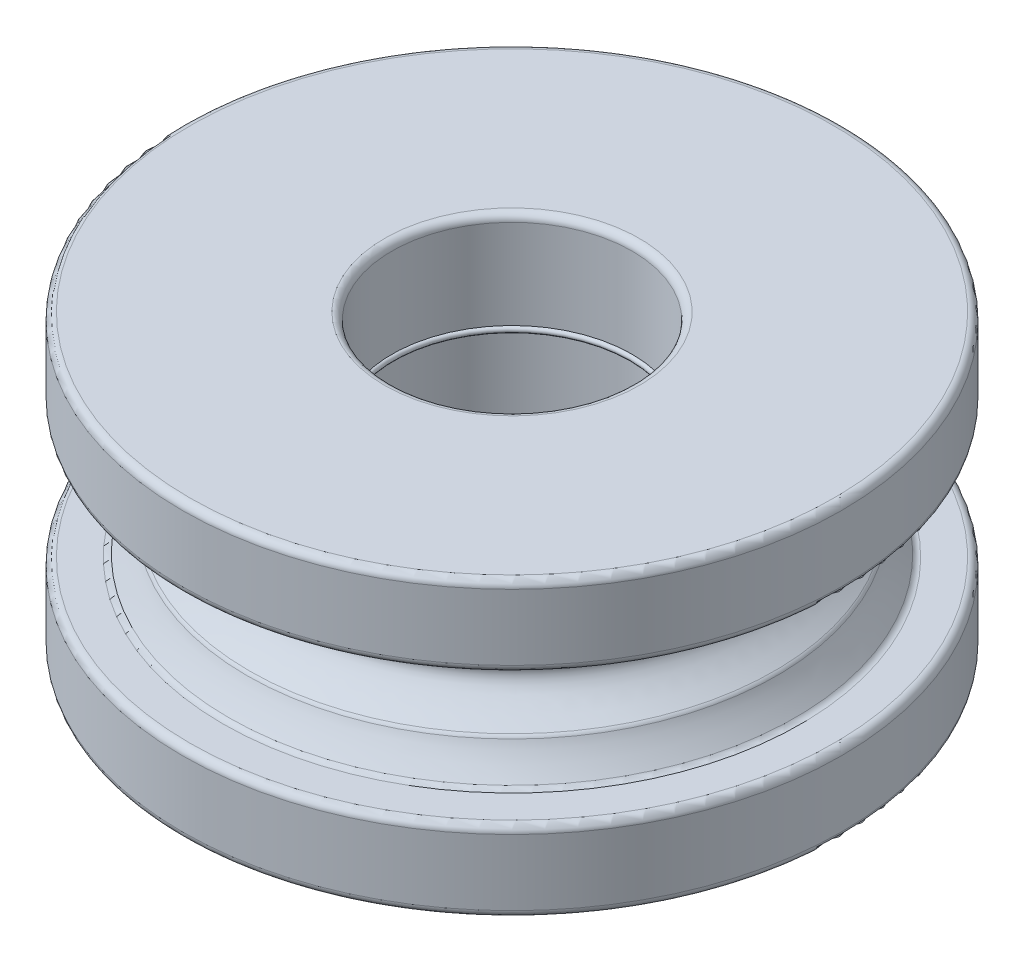
ISO-10303-21;
HEADER;
FILE_DESCRIPTION(('STEP AP214'),'2;1');
FILE_NAME('part.step','',(''),(''),'','','');
FILE_SCHEMA(('AUTOMOTIVE_DESIGN { 1 0 10303 214 1 1 1 1 }'));
ENDSEC;
DATA;
#1=APPLICATION_CONTEXT('core data for automotive mechanical design processes');
#2=APPLICATION_PROTOCOL_DEFINITION('international standard','automotive_design',2000,#1);
#3=PRODUCT_CONTEXT('',#1,'mechanical');
#4=PRODUCT('Part','Part','',(#3));
#5=PRODUCT_RELATED_PRODUCT_CATEGORY('part','',(#4));
#6=PRODUCT_DEFINITION_FORMATION('','',#4);
#7=PRODUCT_DEFINITION_CONTEXT('part definition',#1,'design');
#8=PRODUCT_DEFINITION('design','',#6,#7);
#9=PRODUCT_DEFINITION_SHAPE('','',#8);
#10=(LENGTH_UNIT() NAMED_UNIT(*) SI_UNIT(.MILLI.,.METRE.));
#11=(NAMED_UNIT(*) PLANE_ANGLE_UNIT() SI_UNIT($,.RADIAN.));
#12=(NAMED_UNIT(*) SI_UNIT($,.STERADIAN.) SOLID_ANGLE_UNIT());
#13=UNCERTAINTY_MEASURE_WITH_UNIT(LENGTH_MEASURE(1.E-05),#10,'distance_accuracy_value','');
#14=(GEOMETRIC_REPRESENTATION_CONTEXT(3) GLOBAL_UNCERTAINTY_ASSIGNED_CONTEXT((#13)) GLOBAL_UNIT_ASSIGNED_CONTEXT((#10,
#11,#12)) REPRESENTATION_CONTEXT('',''));
#15=CARTESIAN_POINT('',(0.,0.,0.));
#16=DIRECTION('',(0.,0.,1.));
#17=DIRECTION('',(1.,0.,0.));
#18=AXIS2_PLACEMENT_3D('',#15,#16,#17);
#19=CARTESIAN_POINT('',(0.,7.,0.));
#20=DIRECTION('',(0.,1.,0.));
#21=DIRECTION('',(0.,0.,1.));
#22=AXIS2_PLACEMENT_3D('',#19,#20,#21);
#23=PLANE('',#22);
#24=CARTESIAN_POINT('',(0.,7.,0.));
#25=DIRECTION('',(0.,-1.,0.));
#26=DIRECTION('',(0.,0.,-1.));
#27=AXIS2_PLACEMENT_3D('',#24,#25,#26);
#28=CIRCLE('',#27,4.12);
#29=CARTESIAN_POINT('',(0.,7.,-4.12));
#30=VERTEX_POINT('',#29);
#31=EDGE_CURVE('E112',#30,#30,#28,.T.);
#32=ORIENTED_EDGE('',*,*,#31,.T.);
#33=EDGE_LOOP('',(#32));
#34=FACE_BOUND('',#33,.T.);
#35=CARTESIAN_POINT('',(0.,7.,0.));
#36=DIRECTION('',(0.,1.,0.));
#37=DIRECTION('',(0.,0.,1.));
#38=AXIS2_PLACEMENT_3D('',#35,#36,#37);
#39=CIRCLE('',#38,8.2);
#40=CARTESIAN_POINT('',(0.,7.,8.2));
#41=VERTEX_POINT('',#40);
#42=EDGE_CURVE('E103',#41,#41,#39,.T.);
#43=ORIENTED_EDGE('',*,*,#42,.T.);
#44=EDGE_LOOP('',(#43));
#45=FACE_BOUND('',#44,.T.);
#46=ADVANCED_FACE('F35',(#34,#45),#23,.T.);
#47=CARTESIAN_POINT('',(0.,39.1304347826087,0.));
#48=DIRECTION('',(0.,1.,0.));
#49=DIRECTION('',(0.,0.,1.));
#50=AXIS2_PLACEMENT_3D('',#47,#48,#49);
#51=CYLINDRICAL_SURFACE('',#50,8.2);
#52=CARTESIAN_POINT('',(0.,13.,0.));
#53=DIRECTION('',(0.,1.,0.));
#54=DIRECTION('',(0.,0.,1.));
#55=AXIS2_PLACEMENT_3D('',#52,#53,#54);
#56=CIRCLE('',#55,8.19999999999999);
#57=CARTESIAN_POINT('',(0.,13.,8.19999999999999));
#58=VERTEX_POINT('',#57);
#59=EDGE_CURVE('E106',#58,#58,#56,.T.);
#60=ORIENTED_EDGE('',*,*,#59,.T.);
#61=EDGE_LOOP('',(#60));
#62=FACE_BOUND('',#61,.T.);
#63=ORIENTED_EDGE('',*,*,#42,.F.);
#64=EDGE_LOOP('',(#63));
#65=FACE_BOUND('',#64,.T.);
#66=ADVANCED_FACE('F171',(#62,#65),#51,.F.);
#67=CARTESIAN_POINT('',(0.,13.1988098566354,0.));
#68=DIRECTION('',(0.,1.,0.));
#69=DIRECTION('',(0.,0.,1.));
#70=AXIS2_PLACEMENT_3D('',#67,#68,#69);
#71=TOROIDAL_SURFACE('',#70,8.22178625494686,0.2);
#72=CARTESIAN_POINT('',(0.,13.3976197132708,0.));
#73=DIRECTION('',(0.,1.,0.));
#74=DIRECTION('',(0.,0.,1.));
#75=AXIS2_PLACEMENT_3D('',#72,#73,#74);
#76=CIRCLE('',#75,8.2);
#77=CARTESIAN_POINT('',(0.,13.3976197132708,8.2));
#78=VERTEX_POINT('',#77);
#79=EDGE_CURVE('E109',#78,#78,#76,.T.);
#80=ORIENTED_EDGE('',*,*,#79,.T.);
#81=EDGE_LOOP('',(#80));
#82=FACE_BOUND('',#81,.T.);
#83=ORIENTED_EDGE('',*,*,#59,.F.);
#84=EDGE_LOOP('',(#83));
#85=FACE_BOUND('',#84,.T.);
#86=ADVANCED_FACE('F176',(#82,#85),#71,.T.);
#87=CARTESIAN_POINT('',(0.,39.1304347826087,0.));
#88=DIRECTION('',(0.,1.,0.));
#89=DIRECTION('',(0.,0.,1.));
#90=AXIS2_PLACEMENT_3D('',#87,#88,#89);
#91=CYLINDRICAL_SURFACE('',#90,8.2);
#92=CARTESIAN_POINT('',(0.,19.5,0.));
#93=DIRECTION('',(0.,1.,0.));
#94=DIRECTION('',(0.,0.,1.));
#95=AXIS2_PLACEMENT_3D('',#92,#93,#94);
#96=CIRCLE('',#95,8.2);
#97=CARTESIAN_POINT('',(0.,19.5,8.2));
#98=VERTEX_POINT('',#97);
#99=EDGE_CURVE('E46',#98,#98,#96,.T.);
#100=ORIENTED_EDGE('',*,*,#99,.T.);
#101=EDGE_LOOP('',(#100));
#102=FACE_BOUND('',#101,.T.);
#103=ORIENTED_EDGE('',*,*,#79,.F.);
#104=EDGE_LOOP('',(#103));
#105=FACE_BOUND('',#104,.T.);
#106=ADVANCED_FACE('F217',(#102,#105),#91,.F.);
#107=CARTESIAN_POINT('',(0.,20.,22.5));
#108=DIRECTION('',(0.,1.,0.));
#109=DIRECTION('',(0.,0.,1.));
#110=AXIS2_PLACEMENT_3D('',#107,#108,#109);
#111=PLANE('',#110);
#112=CARTESIAN_POINT('',(0.,20.,0.));
#113=DIRECTION('',(0.,1.,0.));
#114=DIRECTION('',(0.,0.,1.));
#115=AXIS2_PLACEMENT_3D('',#112,#113,#114);
#116=CIRCLE('',#115,8.7);
#117=CARTESIAN_POINT('',(0.,20.,8.7));
#118=VERTEX_POINT('',#117);
#119=EDGE_CURVE('E10',#118,#118,#116,.F.);
#120=ORIENTED_EDGE('',*,*,#119,.T.);
#121=EDGE_LOOP('',(#120));
#122=FACE_BOUND('',#121,.T.);
#123=CARTESIAN_POINT('',(0.,20.,0.));
#124=DIRECTION('',(0.,1.,0.));
#125=DIRECTION('',(0.,0.,1.));
#126=AXIS2_PLACEMENT_3D('',#123,#124,#125);
#127=CIRCLE('',#126,22.);
#128=CARTESIAN_POINT('',(0.,20.,22.));
#129=VERTEX_POINT('',#128);
#130=EDGE_CURVE('E42',#129,#129,#127,.T.);
#131=ORIENTED_EDGE('',*,*,#130,.T.);
#132=EDGE_LOOP('',(#131));
#133=FACE_BOUND('',#132,.T.);
#134=ADVANCED_FACE('F220',(#122,#133),#111,.T.);
#135=CARTESIAN_POINT('',(0.,39.1304347826087,0.));
#136=DIRECTION('',(0.,1.,0.));
#137=DIRECTION('',(0.,0.,1.));
#138=AXIS2_PLACEMENT_3D('',#135,#136,#137);
#139=CYLINDRICAL_SURFACE('',#138,22.5);
#140=CARTESIAN_POINT('',(0.,15.,0.));
#141=DIRECTION('',(0.,-1.,0.));
#142=DIRECTION('',(0.,0.,-1.));
#143=AXIS2_PLACEMENT_3D('',#140,#141,#142);
#144=CIRCLE('',#143,22.5);
#145=CARTESIAN_POINT('',(0.,15.,-22.5));
#146=VERTEX_POINT('',#145);
#147=EDGE_CURVE('E67',#146,#146,#144,.F.);
#148=ORIENTED_EDGE('',*,*,#147,.T.);
#149=EDGE_LOOP('',(#148));
#150=FACE_BOUND('',#149,.T.);
#151=CARTESIAN_POINT('',(0.,19.5,0.));
#152=DIRECTION('',(0.,1.,0.));
#153=DIRECTION('',(0.,0.,1.));
#154=AXIS2_PLACEMENT_3D('',#151,#152,#153);
#155=CIRCLE('',#154,22.5);
#156=CARTESIAN_POINT('',(0.,19.5,22.5));
#157=VERTEX_POINT('',#156);
#158=EDGE_CURVE('E70',#157,#157,#155,.F.);
#159=ORIENTED_EDGE('',*,*,#158,.T.);
#160=EDGE_LOOP('',(#159));
#161=FACE_BOUND('',#160,.T.);
#162=ADVANCED_FACE('F233',(#150,#161),#139,.T.);
#163=CARTESIAN_POINT('',(0.,14.5,22.5));
#164=DIRECTION('',(0.,-1.,0.));
#165=DIRECTION('',(0.,0.,-1.));
#166=AXIS2_PLACEMENT_3D('',#163,#164,#165);
#167=PLANE('',#166);
#168=CARTESIAN_POINT('',(0.,14.5,0.));
#169=DIRECTION('',(0.,-1.,0.));
#170=DIRECTION('',(0.,0.,-1.));
#171=AXIS2_PLACEMENT_3D('',#168,#169,#170);
#172=CIRCLE('',#171,22.);
#173=CARTESIAN_POINT('',(0.,14.5,-22.));
#174=VERTEX_POINT('',#173);
#175=EDGE_CURVE('E61',#174,#174,#172,.T.);
#176=ORIENTED_EDGE('',*,*,#175,.T.);
#177=EDGE_LOOP('',(#176));
#178=FACE_BOUND('',#177,.T.);
#179=CARTESIAN_POINT('',(0.,14.5,0.));
#180=DIRECTION('',(0.,-1.,0.));
#181=DIRECTION('',(0.,0.,-1.));
#182=AXIS2_PLACEMENT_3D('',#179,#180,#181);
#183=CIRCLE('',#182,19.7348816051653);
#184=CARTESIAN_POINT('',(0.,14.5,-19.7348816051653));
#185=VERTEX_POINT('',#184);
#186=EDGE_CURVE('E64',#185,#185,#183,.F.);
#187=ORIENTED_EDGE('',*,*,#186,.T.);
#188=EDGE_LOOP('',(#187));
#189=FACE_BOUND('',#188,.T.);
#190=ADVANCED_FACE('F139',(#178,#189),#167,.T.);
#191=CARTESIAN_POINT('',(0.,14.5,19.5));
#192=CARTESIAN_POINT('',(0.,13.120109751411,18.3432843260555));
#193=CARTESIAN_POINT('',(0.,12.2977511971225,18.0418678917763));
#194=(BOUNDED_CURVE() B_SPLINE_CURVE(2,(#191,#192,#193),.UNSPECIFIED.,.F.,
.F.) B_SPLINE_CURVE_WITH_KNOTS((3,3),(0.,1.),
.UNSPECIFIED.) CURVE() GEOMETRIC_REPRESENTATION_ITEM() RATIONAL_B_SPLINE_CURVE((1.,
1.04569750363022,1.)) REPRESENTATION_ITEM(''));
#195=CARTESIAN_POINT('',(0.,39.1304347826087,0.));
#196=DIRECTION('',(0.,1.,0.));
#197=AXIS1_PLACEMENT('',#195,#196);
#198=SURFACE_OF_REVOLUTION('',#194,#197);
#199=CARTESIAN_POINT('',(0.,12.4232172557941,0.));
#200=DIRECTION('',(0.,1.,0.));
#201=DIRECTION('',(0.,0.,1.));
#202=AXIS2_PLACEMENT_3D('',#199,#200,#201);
#203=CIRCLE('',#202,18.0912034072443);
#204=CARTESIAN_POINT('',(0.,12.4232172557941,18.0912034072443));
#205=VERTEX_POINT('',#204);
#206=EDGE_CURVE('E85',#205,#205,#203,.T.);
#207=ORIENTED_EDGE('',*,*,#206,.T.);
#208=EDGE_LOOP('',(#207));
#209=FACE_BOUND('',#208,.T.);
#210=CARTESIAN_POINT('',(0.,14.3171018357736,0.));
#211=DIRECTION('',(0.,1.,0.));
#212=DIRECTION('',(0.,0.,1.));
#213=AXIS2_PLACEMENT_3D('',#210,#211,#212);
#214=CIRCLE('',#213,19.3482985924125);
#215=CARTESIAN_POINT('',(0.,14.3171018357736,19.3482985924125));
#216=VERTEX_POINT('',#215);
#217=EDGE_CURVE('E88',#216,#216,#214,.F.);
#218=ORIENTED_EDGE('',*,*,#217,.T.);
#219=EDGE_LOOP('',(#218));
#220=FACE_BOUND('',#219,.T.);
#221=ADVANCED_FACE('F135',(#209,#220),#198,.F.);
#222=CARTESIAN_POINT('',(0.,12.2977511971225,18.0418678917763));
#223=CARTESIAN_POINT('',(0.,9.97417557536777,14.8309375272967));
#224=CARTESIAN_POINT('',(0.,7.6505999536132,18.0418678917763));
#225=(BOUNDED_CURVE() B_SPLINE_CURVE(2,(#222,#223,#224),.UNSPECIFIED.,.F.,
.F.) B_SPLINE_CURVE_WITH_KNOTS((3,3),(0.,1.),
.UNSPECIFIED.) CURVE() GEOMETRIC_REPRESENTATION_ITEM() RATIONAL_B_SPLINE_CURVE((1.,
1.84066421515904,1.)) REPRESENTATION_ITEM(''));
#226=CARTESIAN_POINT('',(0.,39.1304347826087,0.));
#227=DIRECTION('',(0.,1.,0.));
#228=AXIS1_PLACEMENT('',#226,#227);
#229=SURFACE_OF_REVOLUTION('',#225,#228);
#230=CARTESIAN_POINT('',(0.,7.73201318372611,0.));
#231=DIRECTION('',(0.,1.,0.));
#232=DIRECTION('',(0.,0.,1.));
#233=AXIS2_PLACEMENT_3D('',#230,#231,#232);
#234=CIRCLE('',#233,17.9299600367875);
#235=CARTESIAN_POINT('',(0.,7.73201318372611,17.9299600367875));
#236=VERTEX_POINT('',#235);
#237=EDGE_CURVE('E97',#236,#236,#234,.T.);
#238=ORIENTED_EDGE('',*,*,#237,.T.);
#239=EDGE_LOOP('',(#238));
#240=FACE_BOUND('',#239,.T.);
#241=CARTESIAN_POINT('',(0.,12.2129581984058,0.));
#242=DIRECTION('',(0.,1.,0.));
#243=DIRECTION('',(0.,0.,1.));
#244=AXIS2_PLACEMENT_3D('',#241,#242,#243);
#245=CIRCLE('',#244,17.9253407868421);
#246=CARTESIAN_POINT('',(0.,12.2129581984058,17.9253407868421));
#247=VERTEX_POINT('',#246);
#248=EDGE_CURVE('E100',#247,#247,#245,.F.);
#249=ORIENTED_EDGE('',*,*,#248,.T.);
#250=EDGE_LOOP('',(#249));
#251=FACE_BOUND('',#250,.T.);
#252=ADVANCED_FACE('F130',(#240,#251),#229,.F.);
#253=CARTESIAN_POINT('',(0.,7.6505999536132,18.0418678917763));
#254=CARTESIAN_POINT('',(0.,6.87989024858889,18.3432843260556));
#255=CARTESIAN_POINT('',(0.,5.5,19.5));
#256=(BOUNDED_CURVE() B_SPLINE_CURVE(2,(#253,#254,#255),.UNSPECIFIED.,.F.,
.F.) B_SPLINE_CURVE_WITH_KNOTS((3,3),(0.,1.),
.UNSPECIFIED.) CURVE() GEOMETRIC_REPRESENTATION_ITEM() RATIONAL_B_SPLINE_CURVE((1.,
1.0456975036304,1.)) REPRESENTATION_ITEM(''));
#257=CARTESIAN_POINT('',(0.,39.1304347826087,0.));
#258=DIRECTION('',(0.,1.,0.));
#259=AXIS1_PLACEMENT('',#257,#258);
#260=SURFACE_OF_REVOLUTION('',#256,#259);
#261=CARTESIAN_POINT('',(0.,7.53145431921964,0.));
#262=DIRECTION('',(0.,1.,0.));
#263=DIRECTION('',(0.,0.,1.));
#264=AXIS2_PLACEMENT_3D('',#261,#262,#263);
#265=CIRCLE('',#264,18.0916979179837);
#266=CARTESIAN_POINT('',(0.,7.53145431921964,18.0916979179837));
#267=VERTEX_POINT('',#266);
#268=EDGE_CURVE('E91',#267,#267,#265,.F.);
#269=ORIENTED_EDGE('',*,*,#268,.T.);
#270=EDGE_LOOP('',(#269));
#271=FACE_BOUND('',#270,.T.);
#272=CARTESIAN_POINT('',(0.,5.68243827028811,0.));
#273=DIRECTION('',(0.,1.,0.));
#274=DIRECTION('',(0.,0.,1.));
#275=AXIS2_PLACEMENT_3D('',#272,#273,#274);
#276=CIRCLE('',#275,19.3484998360961);
#277=CARTESIAN_POINT('',(0.,5.68243827028811,19.3484998360961));
#278=VERTEX_POINT('',#277);
#279=EDGE_CURVE('E94',#278,#278,#276,.T.);
#280=ORIENTED_EDGE('',*,*,#279,.T.);
#281=EDGE_LOOP('',(#280));
#282=FACE_BOUND('',#281,.T.);
#283=ADVANCED_FACE('F125',(#271,#282),#260,.F.);
#284=CARTESIAN_POINT('',(0.,5.5,22.5));
#285=DIRECTION('',(0.,1.,0.));
#286=DIRECTION('',(0.,0.,1.));
#287=AXIS2_PLACEMENT_3D('',#284,#285,#286);
#288=PLANE('',#287);
#289=CARTESIAN_POINT('',(0.,5.5,0.));
#290=DIRECTION('',(0.,1.,0.));
#291=DIRECTION('',(0.,0.,1.));
#292=AXIS2_PLACEMENT_3D('',#289,#290,#291);
#293=CIRCLE('',#292,19.7347051543174);
#294=CARTESIAN_POINT('',(0.,5.5,19.7347051543174));
#295=VERTEX_POINT('',#294);
#296=EDGE_CURVE('E79',#295,#295,#293,.F.);
#297=ORIENTED_EDGE('',*,*,#296,.T.);
#298=EDGE_LOOP('',(#297));
#299=FACE_BOUND('',#298,.T.);
#300=CARTESIAN_POINT('',(0.,5.5,0.));
#301=DIRECTION('',(0.,1.,0.));
#302=DIRECTION('',(0.,0.,1.));
#303=AXIS2_PLACEMENT_3D('',#300,#301,#302);
#304=CIRCLE('',#303,22.);
#305=CARTESIAN_POINT('',(0.,5.5,22.));
#306=VERTEX_POINT('',#305);
#307=EDGE_CURVE('E82',#306,#306,#304,.T.);
#308=ORIENTED_EDGE('',*,*,#307,.T.);
#309=EDGE_LOOP('',(#308));
#310=FACE_BOUND('',#309,.T.);
#311=ADVANCED_FACE('F129',(#299,#310),#288,.T.);
#312=CARTESIAN_POINT('',(0.,39.1304347826087,0.));
#313=DIRECTION('',(0.,1.,0.));
#314=DIRECTION('',(0.,0.,1.));
#315=AXIS2_PLACEMENT_3D('',#312,#313,#314);
#316=CYLINDRICAL_SURFACE('',#315,22.5);
#317=CARTESIAN_POINT('',(0.,5.,0.));
#318=DIRECTION('',(0.,1.,0.));
#319=DIRECTION('',(0.,0.,1.));
#320=AXIS2_PLACEMENT_3D('',#317,#318,#319);
#321=CIRCLE('',#320,22.5);
#322=CARTESIAN_POINT('',(0.,5.,22.5));
#323=VERTEX_POINT('',#322);
#324=EDGE_CURVE('E73',#323,#323,#321,.F.);
#325=ORIENTED_EDGE('',*,*,#324,.T.);
#326=EDGE_LOOP('',(#325));
#327=FACE_BOUND('',#326,.T.);
#328=CARTESIAN_POINT('',(0.,0.5,0.));
#329=DIRECTION('',(0.,-1.,0.));
#330=DIRECTION('',(0.,0.,-1.));
#331=AXIS2_PLACEMENT_3D('',#328,#329,#330);
#332=CIRCLE('',#331,22.5);
#333=CARTESIAN_POINT('',(0.,0.5,-22.5));
#334=VERTEX_POINT('',#333);
#335=EDGE_CURVE('E76',#334,#334,#332,.F.);
#336=ORIENTED_EDGE('',*,*,#335,.T.);
#337=EDGE_LOOP('',(#336));
#338=FACE_BOUND('',#337,.T.);
#339=ADVANCED_FACE('F167',(#327,#338),#316,.T.);
#340=CARTESIAN_POINT('',(0.,0.,22.5));
#341=DIRECTION('',(0.,-1.,0.));
#342=DIRECTION('',(0.,0.,-1.));
#343=AXIS2_PLACEMENT_3D('',#340,#341,#342);
#344=PLANE('',#343);
#345=CARTESIAN_POINT('',(0.,0.,0.));
#346=DIRECTION('',(0.,-1.,0.));
#347=DIRECTION('',(0.,0.,-1.));
#348=AXIS2_PLACEMENT_3D('',#345,#346,#347);
#349=CIRCLE('',#348,22.);
#350=CARTESIAN_POINT('',(0.,0.,-22.));
#351=VERTEX_POINT('',#350);
#352=EDGE_CURVE('E55',#351,#351,#349,.T.);
#353=ORIENTED_EDGE('',*,*,#352,.T.);
#354=EDGE_LOOP('',(#353));
#355=FACE_BOUND('',#354,.T.);
#356=CARTESIAN_POINT('',(0.,0.,0.));
#357=DIRECTION('',(0.,-1.,0.));
#358=DIRECTION('',(0.,0.,-1.));
#359=AXIS2_PLACEMENT_3D('',#356,#357,#358);
#360=CIRCLE('',#359,4.79037988644515);
#361=CARTESIAN_POINT('',(0.,0.,-4.79037988644515));
#362=VERTEX_POINT('',#361);
#363=EDGE_CURVE('E58',#362,#362,#360,.F.);
#364=ORIENTED_EDGE('',*,*,#363,.T.);
#365=EDGE_LOOP('',(#364));
#366=FACE_BOUND('',#365,.T.);
#367=ADVANCED_FACE('F157',(#355,#366),#344,.T.);
#368=CARTESIAN_POINT('',(0.,7.,0.));
#369=DIRECTION('',(0.,-1.,0.));
#370=DIRECTION('',(0.,0.,-1.));
#371=AXIS2_PLACEMENT_3D('',#368,#369,#370);
#372=CONICAL_SURFACE('',#371,4.12,0.026179938779915);
#373=CARTESIAN_POINT('',(0.,0.48691152584604,0.));
#374=DIRECTION('',(0.,1.,0.));
#375=DIRECTION('',(0.,0.,1.));
#376=AXIS2_PLACEMENT_3D('',#373,#374,#375);
#377=CIRCLE('',#376,4.29055122395737);
#378=CARTESIAN_POINT('',(0.,0.48691152584604,4.29055122395737));
#379=VERTEX_POINT('',#378);
#380=EDGE_CURVE('E50',#379,#379,#377,.F.);
#381=ORIENTED_EDGE('',*,*,#380,.T.);
#382=EDGE_LOOP('',(#381));
#383=FACE_BOUND('',#382,.T.);
#384=ORIENTED_EDGE('',*,*,#31,.F.);
#385=EDGE_LOOP('',(#384));
#386=FACE_BOUND('',#385,.T.);
#387=ADVANCED_FACE('F154',(#383,#386),#372,.F.);
#388=CARTESIAN_POINT('',(0.,7.32845799793817,0.));
#389=DIRECTION('',(0.,-1.,0.));
#390=DIRECTION('',(0.,0.,-1.));
#391=AXIS2_PLACEMENT_3D('',#388,#389,#390);
#392=TOROIDAL_SURFACE('',#391,17.6347597454196,0.5);
#393=ORIENTED_EDGE('',*,*,#268,.F.);
#394=EDGE_LOOP('',(#393));
#395=FACE_BOUND('',#394,.T.);
#396=ORIENTED_EDGE('',*,*,#237,.F.);
#397=EDGE_LOOP('',(#396));
#398=FACE_BOUND('',#397,.T.);
#399=ADVANCED_FACE('F156',(#395,#398),#392,.T.);
#400=CARTESIAN_POINT('',(0.,12.6164474747994,0.));
#401=DIRECTION('',(0.,-1.,0.));
#402=DIRECTION('',(0.,0.,-1.));
#403=AXIS2_PLACEMENT_3D('',#400,#401,#402);
#404=TOROIDAL_SURFACE('',#403,17.6300504147752,0.5);
#405=ORIENTED_EDGE('',*,*,#248,.F.);
#406=EDGE_LOOP('',(#405));
#407=FACE_BOUND('',#406,.T.);
#408=ORIENTED_EDGE('',*,*,#206,.F.);
#409=EDGE_LOOP('',(#408));
#410=FACE_BOUND('',#409,.T.);
#411=ADVANCED_FACE('F164',(#407,#410),#404,.T.);
#412=CARTESIAN_POINT('',(0.,6.,0.));
#413=DIRECTION('',(0.,1.,0.));
#414=DIRECTION('',(0.,0.,1.));
#415=AXIS2_PLACEMENT_3D('',#412,#413,#414);
#416=TOROIDAL_SURFACE('',#415,19.7347051543174,0.5);
#417=ORIENTED_EDGE('',*,*,#296,.F.);
#418=EDGE_LOOP('',(#417));
#419=FACE_BOUND('',#418,.T.);
#420=ORIENTED_EDGE('',*,*,#279,.F.);
#421=EDGE_LOOP('',(#420));
#422=FACE_BOUND('',#421,.T.);
#423=ADVANCED_FACE('F183',(#419,#422),#416,.F.);
#424=CARTESIAN_POINT('',(0.,5.,0.));
#425=DIRECTION('',(0.,1.,0.));
#426=DIRECTION('',(0.,0.,1.));
#427=AXIS2_PLACEMENT_3D('',#424,#425,#426);
#428=TOROIDAL_SURFACE('',#427,22.,0.5);
#429=ORIENTED_EDGE('',*,*,#324,.F.);
#430=EDGE_LOOP('',(#429));
#431=FACE_BOUND('',#430,.T.);
#432=ORIENTED_EDGE('',*,*,#307,.F.);
#433=EDGE_LOOP('',(#432));
#434=FACE_BOUND('',#433,.T.);
#435=ADVANCED_FACE('F187',(#431,#434),#428,.T.);
#436=CARTESIAN_POINT('',(0.,15.,0.));
#437=DIRECTION('',(0.,-1.,0.));
#438=DIRECTION('',(0.,0.,-1.));
#439=AXIS2_PLACEMENT_3D('',#436,#437,#438);
#440=TOROIDAL_SURFACE('',#439,22.,0.5);
#441=ORIENTED_EDGE('',*,*,#175,.F.);
#442=EDGE_LOOP('',(#441));
#443=FACE_BOUND('',#442,.T.);
#444=ORIENTED_EDGE('',*,*,#147,.F.);
#445=EDGE_LOOP('',(#444));
#446=FACE_BOUND('',#445,.T.);
#447=ADVANCED_FACE('F191',(#443,#446),#440,.T.);
#448=CARTESIAN_POINT('',(0.,14.,0.));
#449=DIRECTION('',(0.,1.,0.));
#450=DIRECTION('',(0.,0.,1.));
#451=AXIS2_PLACEMENT_3D('',#448,#449,#450);
#452=TOROIDAL_SURFACE('',#451,19.7348816051653,0.5);
#453=ORIENTED_EDGE('',*,*,#217,.F.);
#454=EDGE_LOOP('',(#453));
#455=FACE_BOUND('',#454,.T.);
#456=ORIENTED_EDGE('',*,*,#186,.F.);
#457=EDGE_LOOP('',(#456));
#458=FACE_BOUND('',#457,.T.);
#459=ADVANCED_FACE('F195',(#455,#458),#452,.F.);
#460=CARTESIAN_POINT('',(0.,0.5,0.));
#461=DIRECTION('',(0.,-1.,0.));
#462=DIRECTION('',(0.,0.,-1.));
#463=AXIS2_PLACEMENT_3D('',#460,#461,#462);
#464=TOROIDAL_SURFACE('',#463,22.,0.5);
#465=ORIENTED_EDGE('',*,*,#352,.F.);
#466=EDGE_LOOP('',(#465));
#467=FACE_BOUND('',#466,.T.);
#468=ORIENTED_EDGE('',*,*,#335,.F.);
#469=EDGE_LOOP('',(#468));
#470=FACE_BOUND('',#469,.T.);
#471=ADVANCED_FACE('F199',(#467,#470),#464,.T.);
#472=CARTESIAN_POINT('',(0.,0.499999999999999,0.));
#473=DIRECTION('',(0.,-1.,0.));
#474=DIRECTION('',(0.,0.,-1.));
#475=AXIS2_PLACEMENT_3D('',#472,#473,#474);
#476=TOROIDAL_SURFACE('',#475,4.79037988644515,0.5);
#477=ORIENTED_EDGE('',*,*,#363,.F.);
#478=EDGE_LOOP('',(#477));
#479=FACE_BOUND('',#478,.T.);
#480=ORIENTED_EDGE('',*,*,#380,.F.);
#481=EDGE_LOOP('',(#480));
#482=FACE_BOUND('',#481,.T.);
#483=ADVANCED_FACE('F203',(#479,#482),#476,.T.);
#484=CARTESIAN_POINT('',(0.,19.5,0.));
#485=DIRECTION('',(0.,1.,0.));
#486=DIRECTION('',(0.,0.,1.));
#487=AXIS2_PLACEMENT_3D('',#484,#485,#486);
#488=TOROIDAL_SURFACE('',#487,8.7,0.5);
#489=ORIENTED_EDGE('',*,*,#119,.F.);
#490=EDGE_LOOP('',(#489));
#491=FACE_BOUND('',#490,.T.);
#492=ORIENTED_EDGE('',*,*,#99,.F.);
#493=EDGE_LOOP('',(#492));
#494=FACE_BOUND('',#493,.T.);
#495=ADVANCED_FACE('F206',(#491,#494),#488,.T.);
#496=CARTESIAN_POINT('',(0.,19.5,0.));
#497=DIRECTION('',(0.,1.,0.));
#498=DIRECTION('',(0.,0.,1.));
#499=AXIS2_PLACEMENT_3D('',#496,#497,#498);
#500=TOROIDAL_SURFACE('',#499,22.,0.5);
#501=ORIENTED_EDGE('',*,*,#158,.F.);
#502=EDGE_LOOP('',(#501));
#503=FACE_BOUND('',#502,.T.);
#504=ORIENTED_EDGE('',*,*,#130,.F.);
#505=EDGE_LOOP('',(#504));
#506=FACE_BOUND('',#505,.T.);
#507=ADVANCED_FACE('F37',(#503,#506),#500,.T.);
#508=CLOSED_SHELL('',(#46,#66,#86,#106,#134,#162,#190,#221,#252,#283,#311,#339,#367,#387,#399,
#411,#423,#435,#447,#459,#471,#483,#495,#507));
#509=MANIFOLD_SOLID_BREP('B2',#508);
#510=ADVANCED_BREP_SHAPE_REPRESENTATION('',(#18,#509),#14);
#511=SHAPE_DEFINITION_REPRESENTATION(#9,#510);
ENDSEC;
END-ISO-10303-21;
